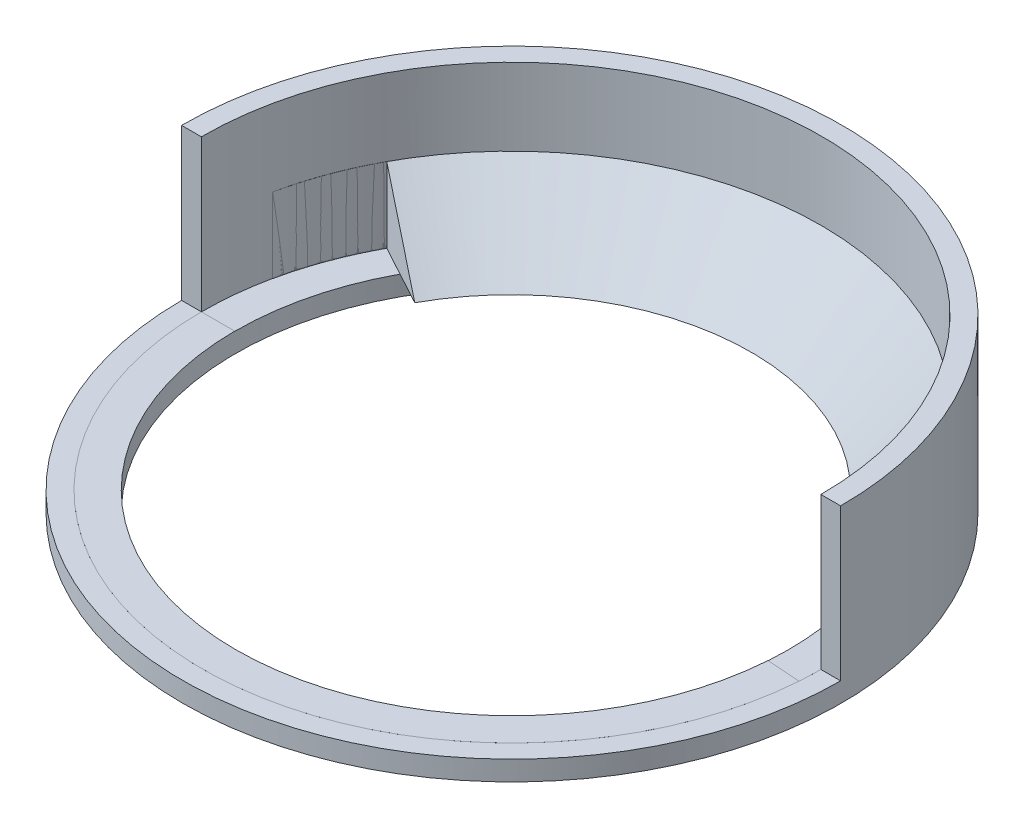
ISO-10303-21;
HEADER;
FILE_DESCRIPTION(('STEP AP214'),'2;1');
FILE_NAME('part.step','',(''),(''),'','','');
FILE_SCHEMA(('AUTOMOTIVE_DESIGN { 1 0 10303 214 1 1 1 1 }'));
ENDSEC;
DATA;
#1=APPLICATION_CONTEXT('core data for automotive mechanical design processes');
#2=APPLICATION_PROTOCOL_DEFINITION('international standard','automotive_design',2000,#1);
#3=PRODUCT_CONTEXT('',#1,'mechanical');
#4=PRODUCT('Part','Part','',(#3));
#5=PRODUCT_RELATED_PRODUCT_CATEGORY('part','',(#4));
#6=PRODUCT_DEFINITION_FORMATION('','',#4);
#7=PRODUCT_DEFINITION_CONTEXT('part definition',#1,'design');
#8=PRODUCT_DEFINITION('design','',#6,#7);
#9=PRODUCT_DEFINITION_SHAPE('','',#8);
#10=(LENGTH_UNIT() NAMED_UNIT(*) SI_UNIT(.MILLI.,.METRE.));
#11=(NAMED_UNIT(*) PLANE_ANGLE_UNIT() SI_UNIT($,.RADIAN.));
#12=(NAMED_UNIT(*) SI_UNIT($,.STERADIAN.) SOLID_ANGLE_UNIT());
#13=UNCERTAINTY_MEASURE_WITH_UNIT(LENGTH_MEASURE(1.E-05),#10,'distance_accuracy_value','');
#14=(GEOMETRIC_REPRESENTATION_CONTEXT(3) GLOBAL_UNCERTAINTY_ASSIGNED_CONTEXT((#13)) GLOBAL_UNIT_ASSIGNED_CONTEXT((#10,
#11,#12)) REPRESENTATION_CONTEXT('',''));
#15=CARTESIAN_POINT('',(0.,0.,0.));
#16=DIRECTION('',(0.,0.,1.));
#17=DIRECTION('',(1.,0.,0.));
#18=AXIS2_PLACEMENT_3D('',#15,#16,#17);
#19=CARTESIAN_POINT('',(-23.4999038261825,1.5,0.0712084203185763));
#20=DIRECTION('',(0.,1.,0.));
#21=DIRECTION('',(-1.,0.,0.));
#22=AXIS2_PLACEMENT_3D('',#19,#20,#21);
#23=PLANE('',#22);
#24=DIRECTION('',(-0.894413130287023,0.,0.447241715820616));
#25=VECTOR('',#24,1.);
#26=CARTESIAN_POINT('',(-18.8278166940009,1.5,9.41464828527145));
#27=LINE('',#26,#25);
#28=CARTESIAN_POINT('',(20.9917102742925,1.5,-10.4966801170182));
#29=VERTEX_POINT('',#28);
#30=CARTESIAN_POINT('',(16.2570612315681,1.5,-8.12916952267244));
#31=VERTEX_POINT('',#30);
#32=EDGE_CURVE('E118',#29,#31,#27,.T.);
#33=ORIENTED_EDGE('',*,*,#32,.T.);
#34=CARTESIAN_POINT('',(0.,1.5,0.0671069133202412));
#35=DIRECTION('',(0.,-1.,0.));
#36=DIRECTION('',(1.,0.,0.));
#37=AXIS2_PLACEMENT_3D('',#34,#35,#36);
#38=CIRCLE('',#37,18.2063446990922);
#39=CARTESIAN_POINT('',(-15.9988902095269,1.5,-8.62234067359039));
#40=VERTEX_POINT('',#39);
#41=EDGE_CURVE('E117',#40,#31,#38,.T.);
#42=ORIENTED_EDGE('',*,*,#41,.F.);
#43=DIRECTION('',(0.878753559484383,0.,0.477275792067362));
#44=VECTOR('',#43,1.);
#45=CARTESIAN_POINT('',(-18.1450892599968,1.5,-9.78800178607371));
#46=LINE('',#45,#44);
#47=CARTESIAN_POINT('',(-20.6506141570449,1.50000000000001,-11.148822879629));
#48=VERTEX_POINT('',#47);
#49=EDGE_CURVE('E98',#48,#40,#46,.T.);
#50=ORIENTED_EDGE('',*,*,#49,.F.);
#51=CARTESIAN_POINT('',(0.,1.5,0.0671069133202412));
#52=DIRECTION('',(0.,1.,0.));
#53=DIRECTION('',(-1.,0.,0.));
#54=AXIS2_PLACEMENT_3D('',#51,#52,#53);
#55=CIRCLE('',#54,23.4998924717436);
#56=CARTESIAN_POINT('',(-22.9848333838979,1.50000000000001,-4.8259882725473));
#57=VERTEX_POINT('',#56);
#58=EDGE_CURVE('E104',#57,#48,#55,.F.);
#59=ORIENTED_EDGE('',*,*,#58,.F.);
#60=DIRECTION('',(0.978082491719274,0.,0.208217769155797));
#61=VECTOR('',#60,1.);
#62=CARTESIAN_POINT('',(-22.4802386811067,1.5,-4.71856831131445));
#63=LINE('',#62,#61);
#64=CARTESIAN_POINT('',(-22.9848448395551,1.5,-4.82599071126938));
#65=VERTEX_POINT('',#64);
#66=EDGE_CURVE('E124',#65,#57,#63,.T.);
#67=ORIENTED_EDGE('',*,*,#66,.F.);
#68=CARTESIAN_POINT('',(0.,1.5,0.0671069133202412));
#69=DIRECTION('',(0.,-1.,0.));
#70=DIRECTION('',(1.,0.,0.));
#71=AXIS2_PLACEMENT_3D('',#68,#69,#70);
#72=CIRCLE('',#71,23.4999041841065);
#73=EDGE_CURVE('E113',#65,#29,#72,.T.);
#74=ORIENTED_EDGE('',*,*,#73,.T.);
#75=EDGE_LOOP('',(#33,#42,#50,#59,#67,#74));
#76=FACE_BOUND('',#75,.T.);
#77=ADVANCED_FACE('F46',(#76),#23,.F.);
#78=CARTESIAN_POINT('',(0.,7.18907418889528,0.0671069133202412));
#79=DIRECTION('',(0.,1.,0.));
#80=DIRECTION('',(-1.,0.,0.));
#81=AXIS2_PLACEMENT_3D('',#78,#79,#80);
#82=CONICAL_SURFACE('',#81,23.4999041841065,0.749400982278209);
#83=CARTESIAN_POINT('',(0.,7.189061601429,0.0671069133202412));
#84=DIRECTION('',(0.,1.,0.));
#85=DIRECTION('',(-1.,0.,0.));
#86=AXIS2_PLACEMENT_3D('',#83,#84,#85);
#87=CIRCLE('',#86,23.4998924717436);
#88=CARTESIAN_POINT('',(-22.984833383898,7.18906160142902,-4.82598827254731));
#89=VERTEX_POINT('',#88);
#90=CARTESIAN_POINT('',(-20.6506141570449,7.18906160142901,-11.148822879629));
#91=VERTEX_POINT('',#90);
#92=EDGE_CURVE('E62',#89,#91,#87,.F.);
#93=ORIENTED_EDGE('',*,*,#92,.T.);
#94=DIRECTION('',(0.598607226270921,-0.732097051273404,0.325120433336666));
#95=VECTOR('',#94,1.);
#96=CARTESIAN_POINT('',(0.,-18.0666537789848,0.0671069133202412));
#97=LINE('',#96,#95);
#98=EDGE_CURVE('E12',#91,#40,#97,.T.);
#99=ORIENTED_EDGE('',*,*,#98,.T.);
#100=ORIENTED_EDGE('',*,*,#41,.T.);
#101=CARTESIAN_POINT('',(20.9918767212185,7.18927418889528,-10.4967633470227));
#102=CARTESIAN_POINT('',(20.2027135171331,6.24102802044445,-10.1021507306533));
#103=CARTESIAN_POINT('',(19.4135500870123,5.29278208714443,-9.70753800125739));
#104=CARTESIAN_POINT('',(17.8352227746996,3.396290690846,-8.91831231641224));
#105=CARTESIAN_POINT('',(17.0460588925078,2.44804522784759,-8.52369936096304));
#106=CARTESIAN_POINT('',(16.2568947842805,1.4998,-8.12908629248722));
#107=B_SPLINE_CURVE_WITH_KNOTS('',3,(#101,#102,#103,#104,#105,#106),.UNSPECIFIED.,.F.,.F.,(4,2,
4),(0.,3.88574526712097,7.771490534242),.UNSPECIFIED.);
#108=CARTESIAN_POINT('',(20.9917102742925,7.18907418889528,-10.4966801170182));
#109=VERTEX_POINT('',#108);
#110=EDGE_CURVE('E115',#109,#31,#107,.T.);
#111=ORIENTED_EDGE('',*,*,#110,.F.);
#112=CARTESIAN_POINT('',(0.,7.18907418889528,0.0671069133202412));
#113=DIRECTION('',(0.,-1.,0.));
#114=DIRECTION('',(1.,0.,0.));
#115=AXIS2_PLACEMENT_3D('',#112,#113,#114);
#116=CIRCLE('',#115,23.4999041841065);
#117=CARTESIAN_POINT('',(-22.984844839555,7.18907418889527,-4.82599071126938));
#118=VERTEX_POINT('',#117);
#119=EDGE_CURVE('E122',#118,#109,#116,.T.);
#120=ORIENTED_EDGE('',*,*,#119,.F.);
#121=DIRECTION('',(0.666270128994717,-0.732097051273404,0.141838015800248));
#122=VECTOR('',#121,1.);
#123=CARTESIAN_POINT('',(0.,-18.0666537789848,0.0671069133202412));
#124=LINE('',#123,#122);
#125=EDGE_CURVE('E108',#118,#89,#124,.T.);
#126=ORIENTED_EDGE('',*,*,#125,.T.);
#127=EDGE_LOOP('',(#93,#99,#100,#111,#120,#126));
#128=FACE_BOUND('',#127,.T.);
#129=ADVANCED_FACE('F48',(#128),#82,.F.);
#130=CARTESIAN_POINT('',(-0.0136666016917367,32.51,0.0641975172925174));
#131=DIRECTION('',(-0.208217769155797,0.,0.978082491719274));
#132=DIRECTION('',(0.978082491719274,0.,0.208217769155797));
#133=AXIS2_PLACEMENT_3D('',#130,#131,#132);
#134=PLANE('',#133);
#135=ORIENTED_EDGE('',*,*,#66,.T.);
#136=DIRECTION('',(0.,-1.,0.));
#137=VECTOR('',#136,1.);
#138=CARTESIAN_POINT('',(-22.9848333838979,27.51,-4.8259882725473));
#139=LINE('',#138,#137);
#140=EDGE_CURVE('E55',#57,#89,#139,.F.);
#141=ORIENTED_EDGE('',*,*,#140,.T.);
#142=ORIENTED_EDGE('',*,*,#125,.F.);
#143=DIRECTION('',(0.,-1.,0.));
#144=VECTOR('',#143,1.);
#145=CARTESIAN_POINT('',(-22.9848448395551,0.,-4.82599071126938));
#146=LINE('',#145,#144);
#147=EDGE_CURVE('E119',#65,#118,#146,.F.);
#148=ORIENTED_EDGE('',*,*,#147,.F.);
#149=EDGE_LOOP('',(#135,#141,#142,#148));
#150=FACE_BOUND('',#149,.T.);
#151=ADVANCED_FACE('F139',(#150),#134,.T.);
#152=CARTESIAN_POINT('',(0.,0.,0.0671069133202412));
#153=DIRECTION('',(0.,-1.,0.));
#154=DIRECTION('',(1.,0.,0.));
#155=AXIS2_PLACEMENT_3D('',#152,#153,#154);
#156=CYLINDRICAL_SURFACE('',#155,23.4999041841065);
#157=DIRECTION('',(0.,-1.,0.));
#158=VECTOR('',#157,1.);
#159=CARTESIAN_POINT('',(20.9917102742925,0.,-10.4966801170182));
#160=LINE('',#159,#158);
#161=EDGE_CURVE('E70',#29,#109,#160,.F.);
#162=ORIENTED_EDGE('',*,*,#161,.F.);
#163=ORIENTED_EDGE('',*,*,#73,.F.);
#164=ORIENTED_EDGE('',*,*,#147,.T.);
#165=ORIENTED_EDGE('',*,*,#119,.T.);
#166=EDGE_LOOP('',(#162,#163,#164,#165));
#167=FACE_BOUND('',#166,.T.);
#168=ADVANCED_FACE('F138',(#167),#156,.T.);
#169=CARTESIAN_POINT('',(0.,14.51,0.));
#170=DIRECTION('',(-0.447241715820616,0.,-0.894413130287023));
#171=DIRECTION('',(-0.894413130287023,0.,0.447241715820616));
#172=AXIS2_PLACEMENT_3D('',#169,#170,#171);
#173=PLANE('',#172);
#174=ORIENTED_EDGE('',*,*,#110,.T.);
#175=ORIENTED_EDGE('',*,*,#32,.F.);
#176=ORIENTED_EDGE('',*,*,#161,.T.);
#177=EDGE_LOOP('',(#174,#175,#176));
#178=FACE_BOUND('',#177,.T.);
#179=ADVANCED_FACE('F133',(#178),#173,.F.);
#180=CARTESIAN_POINT('',(-0.0281451629565942,27.51,0.051820483128305));
#181=DIRECTION('',(-0.477275792067362,0.,0.878753559484383));
#182=DIRECTION('',(0.878753559484383,0.,0.477275792067362));
#183=AXIS2_PLACEMENT_3D('',#180,#181,#182);
#184=PLANE('',#183);
#185=ORIENTED_EDGE('',*,*,#49,.T.);
#186=ORIENTED_EDGE('',*,*,#98,.F.);
#187=DIRECTION('',(0.,-1.,0.));
#188=VECTOR('',#187,1.);
#189=CARTESIAN_POINT('',(-20.6506141570449,27.51,-11.148822879629));
#190=LINE('',#189,#188);
#191=EDGE_CURVE('E96',#91,#48,#190,.T.);
#192=ORIENTED_EDGE('',*,*,#191,.T.);
#193=EDGE_LOOP('',(#185,#186,#192));
#194=FACE_BOUND('',#193,.T.);
#195=ADVANCED_FACE('F95',(#194),#184,.T.);
#196=CARTESIAN_POINT('',(0.,27.51,0.0671069133202412));
#197=DIRECTION('',(0.,-1.,0.));
#198=DIRECTION('',(0.,0.,-1.));
#199=AXIS2_PLACEMENT_3D('',#196,#197,#198);
#200=CYLINDRICAL_SURFACE('',#199,23.4998924717436);
#201=ORIENTED_EDGE('',*,*,#58,.T.);
#202=ORIENTED_EDGE('',*,*,#191,.F.);
#203=ORIENTED_EDGE('',*,*,#92,.F.);
#204=ORIENTED_EDGE('',*,*,#140,.F.);
#205=EDGE_LOOP('',(#201,#202,#203,#204));
#206=FACE_BOUND('',#205,.T.);
#207=ADVANCED_FACE('F102',(#206),#200,.F.);
#208=CLOSED_SHELL('',(#77,#129,#151,#168,#179,#195,#207));
#209=MANIFOLD_SOLID_BREP('B2',#208);
#210=CARTESIAN_POINT('',(0.,0.,0.0671069133202412));
#211=DIRECTION('',(-0.000174532924319865,0.,0.999999984769129));
#212=DIRECTION('',(0.999999984769129,0.,0.000174532924319865));
#213=AXIS2_PLACEMENT_3D('',#210,#211,#212);
#214=PLANE('',#213);
#215=DIRECTION('',(-0.681200332781412,-0.732097051273404,-0.000118891887938832));
#216=VECTOR('',#215,1.);
#217=CARTESIAN_POINT('',(23.4999038261825,7.18907418889528,0.0712084203187299));
#218=LINE('',#217,#216);
#219=CARTESIAN_POINT('',(23.4999038261825,7.18907418889528,0.0712084203187299));
#220=VERTEX_POINT('',#219);
#221=CARTESIAN_POINT('',(23.4998921138197,7.189061601429,0.071208418274537));
#222=VERTEX_POINT('',#221);
#223=EDGE_CURVE('E213',#220,#222,#218,.T.);
#224=ORIENTED_EDGE('',*,*,#223,.T.);
#225=DIRECTION('',(0.,-1.,0.));
#226=VECTOR('',#225,1.);
#227=CARTESIAN_POINT('',(23.4998921138197,14.51,0.071208418274537));
#228=LINE('',#227,#226);
#229=CARTESIAN_POINT('',(23.4998921138197,1.5,0.071208418274537));
#230=VERTEX_POINT('',#229);
#231=EDGE_CURVE('E44',#222,#230,#228,.T.);
#232=ORIENTED_EDGE('',*,*,#231,.T.);
#233=DIRECTION('',(-0.999999984769129,0.,-0.000174532924319865));
#234=VECTOR('',#233,1.);
#235=CARTESIAN_POINT('',(23.4999038261825,1.5,0.0712084203187299));
#236=LINE('',#235,#234);
#237=CARTESIAN_POINT('',(23.4999038261825,1.5,0.0712084203187299));
#238=VERTEX_POINT('',#237);
#239=EDGE_CURVE('E254',#238,#230,#236,.T.);
#240=ORIENTED_EDGE('',*,*,#239,.F.);
#241=DIRECTION('',(0.,1.,0.));
#242=VECTOR('',#241,1.);
#243=CARTESIAN_POINT('',(23.4999038261825,1.5,0.0712084203187299));
#244=LINE('',#243,#242);
#245=EDGE_CURVE('E252',#238,#220,#244,.T.);
#246=ORIENTED_EDGE('',*,*,#245,.T.);
#247=EDGE_LOOP('',(#224,#232,#240,#246));
#248=FACE_BOUND('',#247,.T.);
#249=ADVANCED_FACE('F205',(#248),#214,.T.);
#250=CARTESIAN_POINT('',(0.,0.,0.0671069133202412));
#251=DIRECTION('',(0.,-1.,0.));
#252=DIRECTION('',(1.,0.,0.));
#253=AXIS2_PLACEMENT_3D('',#250,#251,#252);
#254=CYLINDRICAL_SURFACE('',#253,23.4999041841065);
#255=CARTESIAN_POINT('',(0.,1.5,0.0671069133202412));
#256=DIRECTION('',(0.,-1.,0.));
#257=DIRECTION('',(1.,0.,0.));
#258=AXIS2_PLACEMENT_3D('',#255,#256,#257);
#259=CIRCLE('',#258,23.4999041841065);
#260=CARTESIAN_POINT('',(23.4999041841065,1.5,0.067106913319806));
#261=VERTEX_POINT('',#260);
#262=EDGE_CURVE('E227',#261,#238,#259,.T.);
#263=ORIENTED_EDGE('',*,*,#262,.F.);
#264=DIRECTION('',(0.,-1.,0.));
#265=VECTOR('',#264,1.);
#266=CARTESIAN_POINT('',(23.4999041841065,8.,0.0671069133198076));
#267=LINE('',#266,#265);
#268=CARTESIAN_POINT('',(23.4999041841065,7.18907418889528,0.0671069133198074));
#269=VERTEX_POINT('',#268);
#270=EDGE_CURVE('E249',#261,#269,#267,.F.);
#271=ORIENTED_EDGE('',*,*,#270,.T.);
#272=CARTESIAN_POINT('',(0.,7.18907418889528,0.0671069133202412));
#273=DIRECTION('',(0.,-1.,0.));
#274=DIRECTION('',(1.,0.,0.));
#275=AXIS2_PLACEMENT_3D('',#272,#273,#274);
#276=CIRCLE('',#275,23.4999041841065);
#277=EDGE_CURVE('E248',#269,#220,#276,.T.);
#278=ORIENTED_EDGE('',*,*,#277,.T.);
#279=ORIENTED_EDGE('',*,*,#245,.F.);
#280=EDGE_LOOP('',(#263,#271,#278,#279));
#281=FACE_BOUND('',#280,.T.);
#282=ADVANCED_FACE('F207',(#281),#254,.T.);
#283=CARTESIAN_POINT('',(-23.4999038261825,1.5,0.0712084203185763));
#284=DIRECTION('',(0.,1.,0.));
#285=DIRECTION('',(-1.,0.,0.));
#286=AXIS2_PLACEMENT_3D('',#283,#284,#285);
#287=PLANE('',#286);
#288=CARTESIAN_POINT('',(0.,1.5,0.));
#289=DIRECTION('',(0.,1.,0.));
#290=DIRECTION('',(-1.,0.,0.));
#291=AXIS2_PLACEMENT_3D('',#288,#289,#290);
#292=CIRCLE('',#291,23.5);
#293=EDGE_CURVE('E220',#261,#230,#292,.F.);
#294=ORIENTED_EDGE('',*,*,#293,.F.);
#295=ORIENTED_EDGE('',*,*,#262,.T.);
#296=ORIENTED_EDGE('',*,*,#239,.T.);
#297=EDGE_LOOP('',(#294,#295,#296));
#298=FACE_BOUND('',#297,.T.);
#299=ADVANCED_FACE('F259',(#298),#287,.F.);
#300=CARTESIAN_POINT('',(0.,7.18907418889528,0.0671069133202412));
#301=DIRECTION('',(0.,1.,0.));
#302=DIRECTION('',(-1.,0.,0.));
#303=AXIS2_PLACEMENT_3D('',#300,#301,#302);
#304=CONICAL_SURFACE('',#303,23.4999041841065,0.749400982278209);
#305=ORIENTED_EDGE('',*,*,#277,.F.);
#306=CARTESIAN_POINT('',(22.4578007167464,7.21051081967871,-6.92077936123565));
#307=CARTESIAN_POINT('',(22.5458684397292,7.20963451140363,-6.6350002844082));
#308=CARTESIAN_POINT('',(22.6284721816462,7.20875309138728,-6.34756907619321));
#309=CARTESIAN_POINT('',(22.7826525587824,7.20698113255031,-5.76976354321328));
#310=CARTESIAN_POINT('',(22.8542291686002,7.20609059370869,-5.47938921167042));
#311=CARTESIAN_POINT('',(23.0522382704685,7.2034073786324,-4.60453106232709));
#312=CARTESIAN_POINT('',(23.1619911372631,7.20160269473904,-4.01617867211953));
#313=CARTESIAN_POINT('',(23.3343524241693,7.19801311405225,-2.84605182217286));
#314=CARTESIAN_POINT('',(23.397955208201,7.19622867004704,-2.26442215155591));
#315=CARTESIAN_POINT('',(23.4816125224792,7.1926498090637,-1.09803667897976));
#316=CARTESIAN_POINT('',(23.5016681851301,7.19085539234612,-0.513280958707141));
#317=CARTESIAN_POINT('',(23.4981148287309,7.18726658290404,0.65609779937265));
#318=CARTESIAN_POINT('',(23.4745058096787,7.18547219017955,1.24072083717981));
#319=CARTESIAN_POINT('',(23.3837615841124,7.18189343143143,2.40657636135726));
#320=CARTESIAN_POINT('',(23.3166252457115,7.18010906566976,2.98780875916054));
#321=CARTESIAN_POINT('',(23.1371559480599,7.17651971689018,4.15686651273091));
#322=CARTESIAN_POINT('',(23.0238295231747,7.17471518833577,4.74454103902215));
#323=CARTESIAN_POINT('',(22.8205073158856,7.17203228794502,5.6181796758091));
#324=CARTESIAN_POINT('',(22.7471673403647,7.17114186762998,5.90811365399163));
#325=CARTESIAN_POINT('',(22.5894783216427,7.16937017857012,6.48497151951041));
#326=CARTESIAN_POINT('',(22.5051293038012,7.16848890980423,6.77189541377882));
#327=CARTESIAN_POINT('',(22.4153264462346,7.16761277188866,7.05713400104729));
#328=B_SPLINE_CURVE_WITH_KNOTS('',3,(#306,#307,#308,#309,#310,#311,#312,#313,#314,#315,#316,
#317,#318,#319,#320,#321,#322,#323,#324,#325,#326,#327),.UNSPECIFIED.,.F.,.F.,(4,2,2,2,2,2,2,2,
2,2,4),(0.,0.897012331028296,1.7940267283192,3.58763780583959,5.34135230458416,7.09502119898442,
8.8486900934688,10.6024045922921,12.3960156698908,13.2930300672353,14.1900423983208),.UNSPECIFIED.);
#329=EDGE_CURVE('E239',#269,#222,#328,.T.);
#330=ORIENTED_EDGE('',*,*,#329,.T.);
#331=ORIENTED_EDGE('',*,*,#223,.F.);
#332=EDGE_LOOP('',(#305,#330,#331));
#333=FACE_BOUND('',#332,.T.);
#334=ADVANCED_FACE('F247',(#333),#304,.F.);
#335=CARTESIAN_POINT('',(0.,14.51,0.));
#336=DIRECTION('',(0.,-1.,0.));
#337=DIRECTION('',(0.,0.,-1.));
#338=AXIS2_PLACEMENT_3D('',#335,#336,#337);
#339=CYLINDRICAL_SURFACE('',#338,23.5);
#340=ORIENTED_EDGE('',*,*,#293,.T.);
#341=ORIENTED_EDGE('',*,*,#231,.F.);
#342=ORIENTED_EDGE('',*,*,#329,.F.);
#343=ORIENTED_EDGE('',*,*,#270,.F.);
#344=EDGE_LOOP('',(#340,#341,#342,#343));
#345=FACE_BOUND('',#344,.T.);
#346=ADVANCED_FACE('F238',(#345),#339,.F.);
#347=CLOSED_SHELL('',(#249,#282,#299,#334,#346));
#348=MANIFOLD_SOLID_BREP('B6',#347);
#349=CARTESIAN_POINT('',(0.,0.,0.0671069133202412));
#350=DIRECTION('',(-0.000174532924313326,0.,-0.999999984769129));
#351=DIRECTION('',(-0.999999984769129,0.,0.000174532924313326));
#352=AXIS2_PLACEMENT_3D('',#349,#350,#351);
#353=PLANE('',#352);
#354=DIRECTION('',(0.,-1.,0.));
#355=VECTOR('',#354,1.);
#356=CARTESIAN_POINT('',(-23.4998921138197,32.51,0.0712084182743833));
#357=LINE('',#356,#355);
#358=CARTESIAN_POINT('',(-23.4998921138197,7.189061601429,0.0712084182743833));
#359=VERTEX_POINT('',#358);
#360=CARTESIAN_POINT('',(-23.4998921138197,1.5,0.0712084182743833));
#361=VERTEX_POINT('',#360);
#362=EDGE_CURVE('E203',#359,#361,#357,.T.);
#363=ORIENTED_EDGE('',*,*,#362,.F.);
#364=DIRECTION('',(0.681200332781412,-0.732097051273404,-0.000118891887934378));
#365=VECTOR('',#364,1.);
#366=CARTESIAN_POINT('',(-23.4999038261825,7.18907418889528,0.0712084203185763));
#367=LINE('',#366,#365);
#368=CARTESIAN_POINT('',(-23.4999038261825,7.18907418889528,0.0712084203185763));
#369=VERTEX_POINT('',#368);
#370=EDGE_CURVE('E368',#369,#359,#367,.T.);
#371=ORIENTED_EDGE('',*,*,#370,.F.);
#372=DIRECTION('',(0.,1.,0.));
#373=VECTOR('',#372,1.);
#374=CARTESIAN_POINT('',(-23.4999038261825,1.5,0.0712084203185763));
#375=LINE('',#374,#373);
#376=CARTESIAN_POINT('',(-23.4999038261825,1.5,0.0712084203185763));
#377=VERTEX_POINT('',#376);
#378=EDGE_CURVE('E367',#377,#369,#375,.T.);
#379=ORIENTED_EDGE('',*,*,#378,.F.);
#380=DIRECTION('',(0.999999984769129,0.,-0.000174532924313326));
#381=VECTOR('',#380,1.);
#382=CARTESIAN_POINT('',(-23.4999038261825,1.5,0.0712084203185763));
#383=LINE('',#382,#381);
#384=EDGE_CURVE('E364',#377,#361,#383,.T.);
#385=ORIENTED_EDGE('',*,*,#384,.T.);
#386=EDGE_LOOP('',(#363,#371,#379,#385));
#387=FACE_BOUND('',#386,.T.);
#388=ADVANCED_FACE('F320',(#387),#353,.F.);
#389=CARTESIAN_POINT('',(-23.4999038261825,1.5,0.0712084203185763));
#390=DIRECTION('',(0.,1.,0.));
#391=DIRECTION('',(-1.,0.,0.));
#392=AXIS2_PLACEMENT_3D('',#389,#390,#391);
#393=PLANE('',#392);
#394=CARTESIAN_POINT('',(0.,1.5,0.));
#395=DIRECTION('',(0.,1.,0.));
#396=DIRECTION('',(-1.,0.,0.));
#397=AXIS2_PLACEMENT_3D('',#394,#395,#396);
#398=CIRCLE('',#397,23.5);
#399=CARTESIAN_POINT('',(-23.4999041841065,1.5,0.0671069133198052));
#400=VERTEX_POINT('',#399);
#401=EDGE_CURVE('E356',#361,#400,#398,.F.);
#402=ORIENTED_EDGE('',*,*,#401,.F.);
#403=ORIENTED_EDGE('',*,*,#384,.F.);
#404=CARTESIAN_POINT('',(0.,1.5,0.0671069133202412));
#405=DIRECTION('',(0.,-1.,0.));
#406=DIRECTION('',(1.,0.,0.));
#407=AXIS2_PLACEMENT_3D('',#404,#405,#406);
#408=CIRCLE('',#407,23.4999041841065);
#409=EDGE_CURVE('E343',#377,#400,#408,.T.);
#410=ORIENTED_EDGE('',*,*,#409,.T.);
#411=EDGE_LOOP('',(#402,#403,#410));
#412=FACE_BOUND('',#411,.T.);
#413=ADVANCED_FACE('F363',(#412),#393,.F.);
#414=CARTESIAN_POINT('',(0.,7.18907418889528,0.0671069133202412));
#415=DIRECTION('',(0.,1.,0.));
#416=DIRECTION('',(-1.,0.,0.));
#417=AXIS2_PLACEMENT_3D('',#414,#415,#416);
#418=CONICAL_SURFACE('',#417,23.4999041841065,0.749400982278209);
#419=ORIENTED_EDGE('',*,*,#370,.T.);
#420=CARTESIAN_POINT('',(-23.2461740235106,7.17870652508064,3.44461801491274));
#421=CARTESIAN_POINT('',(-23.2875660048715,7.17956419733754,3.16526841094402));
#422=CARTESIAN_POINT('',(-23.323918958471,7.18042397873071,2.88521758946755));
#423=CARTESIAN_POINT('',(-23.3865149604174,7.18214705155668,2.32394387147732));
#424=CARTESIAN_POINT('',(-23.4127564202022,7.18301034351951,2.04272079780673));
#425=CARTESIAN_POINT('',(-23.4761626505671,7.18560050491537,1.19891509738462));
#426=CARTESIAN_POINT('',(-23.4981776784892,7.18733115164444,0.6350586945628));
#427=CARTESIAN_POINT('',(-23.499961916812,7.18913205515056,0.0482517565382171));
#428=CARTESIAN_POINT('',(-23.4999980614177,7.18920312130131,0.0250954427116041));
#429=CARTESIAN_POINT('',(-23.5000562608557,7.19142847339734,-0.700020091315089));
#430=CARTESIAN_POINT('',(-23.4686076026368,7.19358408405179,-1.40250101882371));
#431=CARTESIAN_POINT('',(-23.3743792372781,7.1968040790267,-2.45198212345832));
#432=CARTESIAN_POINT('',(-23.3350806325278,7.19787596279887,-2.8013596492706));
#433=CARTESIAN_POINT('',(-23.2408503275213,7.20001328343821,-3.4980574029053));
#434=CARTESIAN_POINT('',(-23.1859172545101,7.20107871973089,-3.84537744733966));
#435=CARTESIAN_POINT('',(-23.0093488941437,7.20406663870247,-4.81946608479084));
#436=CARTESIAN_POINT('',(-22.8698551757286,7.20597931084976,-5.44308650186013));
#437=CARTESIAN_POINT('',(-22.5405141669642,7.20976359368856,-6.67707671354056));
#438=CARTESIAN_POINT('',(-22.3506457529532,7.21163518679707,-7.28744083294721));
#439=CARTESIAN_POINT('',(-21.9213462714817,7.21532839069119,-8.49199905438257));
#440=CARTESIAN_POINT('',(-21.6818143405226,7.21714989107915,-9.08615742062686));
#441=CARTESIAN_POINT('',(-21.2868688481378,7.21983162228396,-9.96100719998872));
#442=CARTESIAN_POINT('',(-21.1492898157139,7.22071705338961,-10.249873116098));
#443=CARTESIAN_POINT('',(-20.8624562165418,7.22246987119584,-10.8217474984037));
#444=CARTESIAN_POINT('',(-20.7132016976083,7.2233372579703,-11.1047559885821));
#445=CARTESIAN_POINT('',(-20.5582137579307,7.22419500101389,-11.3846320574373));
#446=B_SPLINE_CURVE_WITH_KNOTS('',3,(#420,#421,#422,#423,#424,#425,#426,#427,#428,#429,#430,
#431,#432,#433,#434,#435,#436,#437,#438,#439,#440,#441,#442,#443,#444,#445),.UNSPECIFIED.,.F.,
.F.,(4,2,2,2,2,2,2,2,2,2,2,2,4),(0.,0.847066761153676,1.69426654618492,3.38522429525503,
3.45469456476897,5.56055908918154,6.61505462114684,7.66964276967082,9.58445567316823,
11.5000727892441,13.4196191971643,14.3792598739766,15.3388966209823),.UNSPECIFIED.);
#447=CARTESIAN_POINT('',(-23.4999041841065,7.18907418889528,0.0671069133198058));
#448=VERTEX_POINT('',#447);
#449=EDGE_CURVE('E335',#359,#448,#446,.T.);
#450=ORIENTED_EDGE('',*,*,#449,.T.);
#451=CARTESIAN_POINT('',(0.,7.18907418889528,0.0671069133202412));
#452=DIRECTION('',(0.,-1.,0.));
#453=DIRECTION('',(1.,0.,0.));
#454=AXIS2_PLACEMENT_3D('',#451,#452,#453);
#455=CIRCLE('',#454,23.4999041841065);
#456=EDGE_CURVE('E329',#369,#448,#455,.T.);
#457=ORIENTED_EDGE('',*,*,#456,.F.);
#458=EDGE_LOOP('',(#419,#450,#457));
#459=FACE_BOUND('',#458,.T.);
#460=ADVANCED_FACE('F322',(#459),#418,.F.);
#461=CARTESIAN_POINT('',(0.,0.,0.0671069133202412));
#462=DIRECTION('',(0.,-1.,0.));
#463=DIRECTION('',(1.,0.,0.));
#464=AXIS2_PLACEMENT_3D('',#461,#462,#463);
#465=CYLINDRICAL_SURFACE('',#464,23.4999041841065);
#466=ORIENTED_EDGE('',*,*,#456,.T.);
#467=DIRECTION('',(0.,-1.,0.));
#468=VECTOR('',#467,1.);
#469=CARTESIAN_POINT('',(-23.4999041841065,17.,0.0671069133198014));
#470=LINE('',#469,#468);
#471=EDGE_CURVE('E365',#448,#400,#470,.T.);
#472=ORIENTED_EDGE('',*,*,#471,.T.);
#473=ORIENTED_EDGE('',*,*,#409,.F.);
#474=ORIENTED_EDGE('',*,*,#378,.T.);
#475=EDGE_LOOP('',(#466,#472,#473,#474));
#476=FACE_BOUND('',#475,.T.);
#477=ADVANCED_FACE('F374',(#476),#465,.T.);
#478=CARTESIAN_POINT('',(0.,32.51,0.));
#479=DIRECTION('',(0.,-1.,0.));
#480=DIRECTION('',(0.,0.,-1.));
#481=AXIS2_PLACEMENT_3D('',#478,#479,#480);
#482=CYLINDRICAL_SURFACE('',#481,23.5);
#483=ORIENTED_EDGE('',*,*,#362,.T.);
#484=ORIENTED_EDGE('',*,*,#401,.T.);
#485=ORIENTED_EDGE('',*,*,#471,.F.);
#486=ORIENTED_EDGE('',*,*,#449,.F.);
#487=EDGE_LOOP('',(#483,#484,#485,#486));
#488=FACE_BOUND('',#487,.T.);
#489=ADVANCED_FACE('F355',(#488),#482,.F.);
#490=CLOSED_SHELL('',(#388,#413,#460,#477,#489));
#491=MANIFOLD_SOLID_BREP('B38',#490);
#492=CARTESIAN_POINT('',(0.,1.5,0.));
#493=DIRECTION('',(0.,1.,0.));
#494=DIRECTION('',(0.,0.,1.));
#495=AXIS2_PLACEMENT_3D('',#492,#493,#494);
#496=PLANE('',#495);
#497=CARTESIAN_POINT('',(0.,1.5,0.));
#498=DIRECTION('',(0.,1.,0.));
#499=DIRECTION('',(0.,0.,1.));
#500=AXIS2_PLACEMENT_3D('',#497,#498,#499);
#501=CIRCLE('',#500,20.9643438486524);
#502=CARTESIAN_POINT('',(18.7507844060867,1.5,-9.3761291139247));
#503=VERTEX_POINT('',#502);
#504=CARTESIAN_POINT('',(-18.4505640593543,1.5,-9.95391374767706));
#505=VERTEX_POINT('',#504);
#506=EDGE_CURVE('E443',#503,#505,#501,.T.);
#507=ORIENTED_EDGE('',*,*,#506,.F.);
#508=DIRECTION('',(-0.894413130287023,0.,0.447241715820616));
#509=VECTOR('',#508,1.);
#510=CARTESIAN_POINT('',(0.,1.5,0.));
#511=LINE('',#510,#509);
#512=CARTESIAN_POINT('',(21.018708561745,1.5,-10.5101803217845));
#513=VERTEX_POINT('',#512);
#514=EDGE_CURVE('E559',#513,#503,#511,.T.);
#515=ORIENTED_EDGE('',*,*,#514,.F.);
#516=CARTESIAN_POINT('',(0.,1.5,0.));
#517=DIRECTION('',(0.,1.,0.));
#518=DIRECTION('',(0.,0.,1.));
#519=AXIS2_PLACEMENT_3D('',#516,#517,#518);
#520=CIRCLE('',#519,23.5);
#521=CARTESIAN_POINT('',(-22.9985155042715,1.5,-4.82890097224863));
#522=VERTEX_POINT('',#521);
#523=EDGE_CURVE('E618',#522,#513,#520,.F.);
#524=ORIENTED_EDGE('',*,*,#523,.F.);
#525=DIRECTION('',(0.978082491719274,0.,0.208217769155797));
#526=VECTOR('',#525,1.);
#527=CARTESIAN_POINT('',(-0.0136666016917367,1.5,0.0641975172925174));
#528=LINE('',#527,#526);
#529=CARTESIAN_POINT('',(-22.9848333838979,1.50000000000001,-4.8259882725473));
#530=VERTEX_POINT('',#529);
#531=EDGE_CURVE('E437',#522,#530,#528,.T.);
#532=ORIENTED_EDGE('',*,*,#531,.T.);
#533=CARTESIAN_POINT('',(0.,1.5,0.0671069133202412));
#534=DIRECTION('',(0.,1.,0.));
#535=DIRECTION('',(0.,0.,1.));
#536=AXIS2_PLACEMENT_3D('',#533,#534,#535);
#537=CIRCLE('',#536,23.4998924717436);
#538=CARTESIAN_POINT('',(-20.6506141570449,1.50000000000001,-11.148822879629));
#539=VERTEX_POINT('',#538);
#540=EDGE_CURVE('E625',#530,#539,#537,.F.);
#541=ORIENTED_EDGE('',*,*,#540,.T.);
#542=DIRECTION('',(0.878753559484383,0.,0.477275792067362));
#543=VECTOR('',#542,1.);
#544=CARTESIAN_POINT('',(-0.0281451629565942,1.5,0.051820483128305));
#545=LINE('',#544,#543);
#546=EDGE_CURVE('E664',#539,#505,#545,.T.);
#547=ORIENTED_EDGE('',*,*,#546,.T.);
#548=EDGE_LOOP('',(#507,#515,#524,#532,#541,#547));
#549=FACE_BOUND('',#548,.T.);
#550=ADVANCED_FACE('F429',(#549),#496,.T.);
#551=CARTESIAN_POINT('',(-20.9642244120187,1.5,0.0707658607685606));
#552=VERTEX_POINT('',#551);
#553=CARTESIAN_POINT('',(20.9116039328337,1.5,1.48611371059778));
#554=VERTEX_POINT('',#553);
#555=EDGE_CURVE('E533',#552,#554,#501,.T.);
#556=ORIENTED_EDGE('',*,*,#555,.F.);
#557=DIRECTION('',(0.999999984769129,0.,-0.000174532924313326));
#558=VECTOR('',#557,1.);
#559=CARTESIAN_POINT('',(1.17123656450331E-05,1.5,0.0671069112760477));
#560=LINE('',#559,#558);
#561=CARTESIAN_POINT('',(-23.4998921138197,1.5,0.0712084182743833));
#562=VERTEX_POINT('',#561);
#563=EDGE_CURVE('E582',#562,#552,#560,.T.);
#564=ORIENTED_EDGE('',*,*,#563,.F.);
#565=CARTESIAN_POINT('',(23.4408811441613,1.5,1.66586049394972));
#566=VERTEX_POINT('',#565);
#567=EDGE_CURVE('E558',#566,#562,#520,.F.);
#568=ORIENTED_EDGE('',*,*,#567,.F.);
#569=DIRECTION('',(-0.997484304006865,0.,-0.0708876805936049));
#570=VECTOR('',#569,1.);
#571=CARTESIAN_POINT('',(0.,1.5,0.));
#572=LINE('',#571,#570);
#573=EDGE_CURVE('E549',#566,#554,#572,.T.);
#574=ORIENTED_EDGE('',*,*,#573,.T.);
#575=EDGE_LOOP('',(#556,#564,#568,#574));
#576=FACE_BOUND('',#575,.T.);
#577=ADVANCED_FACE('F557',(#576),#496,.T.);
#578=CARTESIAN_POINT('',(-0.0136666016917367,32.51,0.0641975172925174));
#579=DIRECTION('',(-0.208217769155797,0.,0.978082491719274));
#580=DIRECTION('',(0.978082491719274,0.,0.208217769155797));
#581=AXIS2_PLACEMENT_3D('',#578,#579,#580);
#582=PLANE('',#581);
#583=DIRECTION('',(-0.978082491719274,0.,-0.208217769155797));
#584=VECTOR('',#583,1.);
#585=CARTESIAN_POINT('',(-0.0136666016917367,1.49,0.0641975172925174));
#586=LINE('',#585,#584);
#587=CARTESIAN_POINT('',(-22.984833383898,1.49,-4.82598827254731));
#588=VERTEX_POINT('',#587);
#589=CARTESIAN_POINT('',(-22.9985155042715,1.49,-4.82890097224863));
#590=VERTEX_POINT('',#589);
#591=EDGE_CURVE('E570',#588,#590,#586,.T.);
#592=ORIENTED_EDGE('',*,*,#591,.F.);
#593=DIRECTION('',(0.,-1.,0.));
#594=VECTOR('',#593,1.);
#595=CARTESIAN_POINT('',(-22.9848333838979,27.51,-4.8259882725473));
#596=LINE('',#595,#594);
#597=EDGE_CURVE('E633',#530,#588,#596,.T.);
#598=ORIENTED_EDGE('',*,*,#597,.F.);
#599=ORIENTED_EDGE('',*,*,#531,.F.);
#600=DIRECTION('',(0.,-1.,0.));
#601=VECTOR('',#600,1.);
#602=CARTESIAN_POINT('',(-22.9985155042715,32.51,-4.82890097224863));
#603=LINE('',#602,#601);
#604=EDGE_CURVE('E579',#522,#590,#603,.T.);
#605=ORIENTED_EDGE('',*,*,#604,.T.);
#606=EDGE_LOOP('',(#592,#598,#599,#605));
#607=FACE_BOUND('',#606,.T.);
#608=ADVANCED_FACE('F631',(#607),#582,.T.);
#609=CARTESIAN_POINT('',(0.,16.5,0.));
#610=DIRECTION('',(0.,-1.,0.));
#611=DIRECTION('',(0.,0.,-1.));
#612=AXIS2_PLACEMENT_3D('',#609,#610,#611);
#613=CYLINDRICAL_SURFACE('',#612,23.5);
#614=DIRECTION('',(0.,-1.,0.));
#615=VECTOR('',#614,1.);
#616=CARTESIAN_POINT('',(23.4408811441613,14.51,1.66586049394972));
#617=LINE('',#616,#615);
#618=CARTESIAN_POINT('',(23.4408811441613,1.499,1.66586049394972));
#619=VERTEX_POINT('',#618);
#620=EDGE_CURVE('E560',#566,#619,#617,.T.);
#621=ORIENTED_EDGE('',*,*,#620,.F.);
#622=ORIENTED_EDGE('',*,*,#567,.T.);
#623=DIRECTION('',(0.,-1.,0.));
#624=VECTOR('',#623,1.);
#625=CARTESIAN_POINT('',(-23.4998921138197,32.51,0.0712084182743833));
#626=LINE('',#625,#624);
#627=CARTESIAN_POINT('',(-23.4998921138197,1.499,0.0712084182743833));
#628=VERTEX_POINT('',#627);
#629=EDGE_CURVE('E578',#562,#628,#626,.T.);
#630=ORIENTED_EDGE('',*,*,#629,.T.);
#631=CARTESIAN_POINT('',(0.,1.499,0.));
#632=DIRECTION('',(0.,1.,0.));
#633=DIRECTION('',(0.,0.,1.));
#634=AXIS2_PLACEMENT_3D('',#631,#632,#633);
#635=CIRCLE('',#634,23.5);
#636=EDGE_CURVE('E588',#628,#619,#635,.T.);
#637=ORIENTED_EDGE('',*,*,#636,.T.);
#638=EDGE_LOOP('',(#621,#622,#630,#637));
#639=FACE_BOUND('',#638,.T.);
#640=ADVANCED_FACE('F720',(#639),#613,.T.);
#641=CARTESIAN_POINT('',(0.,1.5,0.));
#642=DIRECTION('',(0.,-1.,0.));
#643=DIRECTION('',(0.,0.,-1.));
#644=AXIS2_PLACEMENT_3D('',#641,#642,#643);
#645=CYLINDRICAL_SURFACE('',#644,25.);
#646=CARTESIAN_POINT('',(0.,0.,0.));
#647=DIRECTION('',(0.,1.,0.));
#648=DIRECTION('',(0.,0.,1.));
#649=AXIS2_PLACEMENT_3D('',#646,#647,#648);
#650=CIRCLE('',#649,25.);
#651=CARTESIAN_POINT('',(0.,0.,25.));
#652=VERTEX_POINT('',#651);
#653=EDGE_CURVE('E615',#652,#652,#650,.T.);
#654=ORIENTED_EDGE('',*,*,#653,.T.);
#655=EDGE_LOOP('',(#654));
#656=FACE_BOUND('',#655,.T.);
#657=DIRECTION('',(0.,-1.,0.));
#658=VECTOR('',#657,1.);
#659=CARTESIAN_POINT('',(-24.9999099330815,16.5,0.0671069133202441));
#660=LINE('',#659,#658);
#661=CARTESIAN_POINT('',(-24.9999099330815,13.,0.0671069133202441));
#662=VERTEX_POINT('',#661);
#663=CARTESIAN_POINT('',(-24.9999099330815,1.499,0.0671069133202441));
#664=VERTEX_POINT('',#663);
#665=EDGE_CURVE('E601',#662,#664,#660,.T.);
#666=ORIENTED_EDGE('',*,*,#665,.F.);
#667=CARTESIAN_POINT('',(0.,13.,0.));
#668=DIRECTION('',(0.,1.,0.));
#669=DIRECTION('',(0.,0.,1.));
#670=AXIS2_PLACEMENT_3D('',#667,#668,#669);
#671=CIRCLE('',#670,25.);
#672=CARTESIAN_POINT('',(24.9999099330815,13.,0.0671069133202441));
#673=VERTEX_POINT('',#672);
#674=EDGE_CURVE('E610',#673,#662,#671,.T.);
#675=ORIENTED_EDGE('',*,*,#674,.F.);
#676=DIRECTION('',(0.,-1.,0.));
#677=VECTOR('',#676,1.);
#678=CARTESIAN_POINT('',(24.9999099330815,16.5,0.0671069133202441));
#679=LINE('',#678,#677);
#680=CARTESIAN_POINT('',(24.9999099330815,1.499,0.0671069133202441));
#681=VERTEX_POINT('',#680);
#682=EDGE_CURVE('E598',#673,#681,#679,.T.);
#683=ORIENTED_EDGE('',*,*,#682,.T.);
#684=CARTESIAN_POINT('',(0.,1.499,0.));
#685=DIRECTION('',(0.,1.,0.));
#686=DIRECTION('',(0.,0.,1.));
#687=AXIS2_PLACEMENT_3D('',#684,#685,#686);
#688=CIRCLE('',#687,25.);
#689=EDGE_CURVE('E591',#664,#681,#688,.T.);
#690=ORIENTED_EDGE('',*,*,#689,.F.);
#691=EDGE_LOOP('',(#666,#675,#683,#690));
#692=FACE_BOUND('',#691,.T.);
#693=ADVANCED_FACE('F431',(#656,#692),#645,.T.);
#694=CARTESIAN_POINT('',(0.,13.,0.));
#695=DIRECTION('',(0.,-1.,0.));
#696=DIRECTION('',(0.,0.,-1.));
#697=AXIS2_PLACEMENT_3D('',#694,#695,#696);
#698=CYLINDRICAL_SURFACE('',#697,23.5);
#699=ORIENTED_EDGE('',*,*,#523,.T.);
#700=DIRECTION('',(0.,-1.,0.));
#701=VECTOR('',#700,1.);
#702=CARTESIAN_POINT('',(21.018708561745,14.51,-10.5101803217845));
#703=LINE('',#702,#701);
#704=CARTESIAN_POINT('',(21.018708561745,1.49,-10.5101803217845));
#705=VERTEX_POINT('',#704);
#706=EDGE_CURVE('E671',#513,#705,#703,.T.);
#707=ORIENTED_EDGE('',*,*,#706,.T.);
#708=CARTESIAN_POINT('',(0.,1.49,0.));
#709=DIRECTION('',(0.,1.,0.));
#710=DIRECTION('',(0.,0.,1.));
#711=AXIS2_PLACEMENT_3D('',#708,#709,#710);
#712=CIRCLE('',#711,23.5);
#713=CARTESIAN_POINT('',(23.4408811441613,1.49,1.66586049394972));
#714=VERTEX_POINT('',#713);
#715=EDGE_CURVE('E669',#714,#705,#712,.T.);
#716=ORIENTED_EDGE('',*,*,#715,.F.);
#717=EDGE_CURVE('E565',#619,#714,#617,.T.);
#718=ORIENTED_EDGE('',*,*,#717,.F.);
#719=CARTESIAN_POINT('',(23.4999041841065,1.499,0.067106913320244));
#720=VERTEX_POINT('',#719);
#721=EDGE_CURVE('E584',#619,#720,#635,.T.);
#722=ORIENTED_EDGE('',*,*,#721,.T.);
#723=DIRECTION('',(0.,-1.,0.));
#724=VECTOR('',#723,1.);
#725=CARTESIAN_POINT('',(23.4999041841065,16.5,0.067106913320244));
#726=LINE('',#725,#724);
#727=CARTESIAN_POINT('',(23.4999041841065,13.,0.067106913320244));
#728=VERTEX_POINT('',#727);
#729=EDGE_CURVE('E596',#728,#720,#726,.T.);
#730=ORIENTED_EDGE('',*,*,#729,.F.);
#731=CARTESIAN_POINT('',(0.,13.,0.));
#732=DIRECTION('',(0.,1.,0.));
#733=DIRECTION('',(0.,0.,1.));
#734=AXIS2_PLACEMENT_3D('',#731,#732,#733);
#735=CIRCLE('',#734,23.5);
#736=CARTESIAN_POINT('',(-23.4999041841065,13.,0.067106913320244));
#737=VERTEX_POINT('',#736);
#738=EDGE_CURVE('E613',#728,#737,#735,.T.);
#739=ORIENTED_EDGE('',*,*,#738,.T.);
#740=DIRECTION('',(0.,-1.,0.));
#741=VECTOR('',#740,1.);
#742=CARTESIAN_POINT('',(-23.4999041841065,16.5,0.067106913320244));
#743=LINE('',#742,#741);
#744=CARTESIAN_POINT('',(-23.4999041841065,1.499,0.067106913320244));
#745=VERTEX_POINT('',#744);
#746=EDGE_CURVE('E603',#737,#745,#743,.T.);
#747=ORIENTED_EDGE('',*,*,#746,.T.);
#748=EDGE_CURVE('E585',#745,#628,#635,.T.);
#749=ORIENTED_EDGE('',*,*,#748,.T.);
#750=CARTESIAN_POINT('',(-23.4998921138197,1.49,0.0712084182743833));
#751=VERTEX_POINT('',#750);
#752=EDGE_CURVE('E575',#628,#751,#626,.T.);
#753=ORIENTED_EDGE('',*,*,#752,.T.);
#754=CARTESIAN_POINT('',(0.,1.49,0.));
#755=DIRECTION('',(0.,1.,0.));
#756=DIRECTION('',(0.,0.,1.));
#757=AXIS2_PLACEMENT_3D('',#754,#755,#756);
#758=CIRCLE('',#757,23.5);
#759=EDGE_CURVE('E572',#590,#751,#758,.T.);
#760=ORIENTED_EDGE('',*,*,#759,.F.);
#761=ORIENTED_EDGE('',*,*,#604,.F.);
#762=EDGE_LOOP('',(#699,#707,#716,#718,#722,#730,#739,#747,#749,#753,#760,#761));
#763=FACE_BOUND('',#762,.T.);
#764=ADVANCED_FACE('F635',(#763),#698,.F.);
#765=CARTESIAN_POINT('',(0.,13.,0.));
#766=DIRECTION('',(0.,1.,0.));
#767=DIRECTION('',(0.,0.,1.));
#768=AXIS2_PLACEMENT_3D('',#765,#766,#767);
#769=PLANE('',#768);
#770=ORIENTED_EDGE('',*,*,#674,.T.);
#771=DIRECTION('',(1.,0.,0.));
#772=VECTOR('',#771,1.);
#773=CARTESIAN_POINT('',(0.,13.,0.0671069133202412));
#774=LINE('',#773,#772);
#775=EDGE_CURVE('E607',#662,#737,#774,.T.);
#776=ORIENTED_EDGE('',*,*,#775,.T.);
#777=ORIENTED_EDGE('',*,*,#738,.F.);
#778=DIRECTION('',(-1.,0.,0.));
#779=VECTOR('',#778,1.);
#780=CARTESIAN_POINT('',(0.,13.,0.0671069133202412));
#781=LINE('',#780,#779);
#782=EDGE_CURVE('E605',#673,#728,#781,.T.);
#783=ORIENTED_EDGE('',*,*,#782,.F.);
#784=EDGE_LOOP('',(#770,#776,#777,#783));
#785=FACE_BOUND('',#784,.T.);
#786=ADVANCED_FACE('F704',(#785),#769,.T.);
#787=CARTESIAN_POINT('',(0.,0.,0.));
#788=DIRECTION('',(0.,1.,0.));
#789=DIRECTION('',(0.,0.,1.));
#790=AXIS2_PLACEMENT_3D('',#787,#788,#789);
#791=PLANE('',#790);
#792=CARTESIAN_POINT('',(0.,0.,0.));
#793=DIRECTION('',(0.,1.,0.));
#794=DIRECTION('',(0.,0.,1.));
#795=AXIS2_PLACEMENT_3D('',#792,#793,#794);
#796=CIRCLE('',#795,20.9643438486524);
#797=CARTESIAN_POINT('',(0.,0.,20.9643438486524));
#798=VERTEX_POINT('',#797);
#799=EDGE_CURVE('E653',#798,#798,#796,.T.);
#800=ORIENTED_EDGE('',*,*,#799,.T.);
#801=EDGE_LOOP('',(#800));
#802=FACE_BOUND('',#801,.T.);
#803=ORIENTED_EDGE('',*,*,#653,.F.);
#804=EDGE_LOOP('',(#803));
#805=FACE_BOUND('',#804,.T.);
#806=ADVANCED_FACE('F701',(#802,#805),#791,.F.);
#807=CARTESIAN_POINT('',(0.,16.5,0.0671069133202412));
#808=DIRECTION('',(0.,0.,1.));
#809=DIRECTION('',(1.,0.,0.));
#810=AXIS2_PLACEMENT_3D('',#807,#808,#809);
#811=PLANE('',#810);
#812=ORIENTED_EDGE('',*,*,#665,.T.);
#813=DIRECTION('',(-1.,0.,0.));
#814=VECTOR('',#813,1.);
#815=CARTESIAN_POINT('',(0.,1.499,0.0671069133202412));
#816=LINE('',#815,#814);
#817=EDGE_CURVE('E587',#745,#664,#816,.T.);
#818=ORIENTED_EDGE('',*,*,#817,.F.);
#819=ORIENTED_EDGE('',*,*,#746,.F.);
#820=ORIENTED_EDGE('',*,*,#775,.F.);
#821=EDGE_LOOP('',(#812,#818,#819,#820));
#822=FACE_BOUND('',#821,.T.);
#823=ADVANCED_FACE('F703',(#822),#811,.T.);
#824=CARTESIAN_POINT('',(0.,16.5,0.0671069133202412));
#825=DIRECTION('',(0.,0.,-1.));
#826=DIRECTION('',(-1.,0.,0.));
#827=AXIS2_PLACEMENT_3D('',#824,#825,#826);
#828=PLANE('',#827);
#829=ORIENTED_EDGE('',*,*,#782,.T.);
#830=ORIENTED_EDGE('',*,*,#729,.T.);
#831=DIRECTION('',(1.,0.,0.));
#832=VECTOR('',#831,1.);
#833=CARTESIAN_POINT('',(0.,1.499,0.0671069133202412));
#834=LINE('',#833,#832);
#835=EDGE_CURVE('E594',#720,#681,#834,.T.);
#836=ORIENTED_EDGE('',*,*,#835,.T.);
#837=ORIENTED_EDGE('',*,*,#682,.F.);
#838=EDGE_LOOP('',(#829,#830,#836,#837));
#839=FACE_BOUND('',#838,.T.);
#840=ADVANCED_FACE('F710',(#839),#828,.F.);
#841=CARTESIAN_POINT('',(0.,1.499,0.));
#842=DIRECTION('',(0.,1.,0.));
#843=DIRECTION('',(0.,0.,1.));
#844=AXIS2_PLACEMENT_3D('',#841,#842,#843);
#845=PLANE('',#844);
#846=ORIENTED_EDGE('',*,*,#748,.F.);
#847=ORIENTED_EDGE('',*,*,#817,.T.);
#848=ORIENTED_EDGE('',*,*,#689,.T.);
#849=ORIENTED_EDGE('',*,*,#835,.F.);
#850=ORIENTED_EDGE('',*,*,#721,.F.);
#851=ORIENTED_EDGE('',*,*,#636,.F.);
#852=EDGE_LOOP('',(#846,#847,#848,#849,#850,#851));
#853=FACE_BOUND('',#852,.T.);
#854=ADVANCED_FACE('F735',(#853),#845,.T.);
#855=CARTESIAN_POINT('',(1.17123656450331E-05,32.51,0.0671069112760477));
#856=DIRECTION('',(0.000174532924313326,0.,0.999999984769129));
#857=DIRECTION('',(0.999999984769129,0.,-0.000174532924313326));
#858=AXIS2_PLACEMENT_3D('',#855,#856,#857);
#859=PLANE('',#858);
#860=ORIENTED_EDGE('',*,*,#563,.T.);
#861=DIRECTION('',(0.,1.,0.));
#862=VECTOR('',#861,1.);
#863=CARTESIAN_POINT('',(-20.9642244120187,-8.5,0.0707658607685606));
#864=LINE('',#863,#862);
#865=CARTESIAN_POINT('',(-20.9642244120187,1.49,0.0707658607685606));
#866=VERTEX_POINT('',#865);
#867=EDGE_CURVE('E540',#552,#866,#864,.F.);
#868=ORIENTED_EDGE('',*,*,#867,.T.);
#869=DIRECTION('',(-0.999999984769129,0.,0.000174532924313326));
#870=VECTOR('',#869,1.);
#871=CARTESIAN_POINT('',(1.17123656450331E-05,1.49,0.0671069112760477));
#872=LINE('',#871,#870);
#873=EDGE_CURVE('E563',#866,#751,#872,.T.);
#874=ORIENTED_EDGE('',*,*,#873,.T.);
#875=ORIENTED_EDGE('',*,*,#752,.F.);
#876=ORIENTED_EDGE('',*,*,#629,.F.);
#877=EDGE_LOOP('',(#860,#868,#874,#875,#876));
#878=FACE_BOUND('',#877,.T.);
#879=ADVANCED_FACE('F644',(#878),#859,.F.);
#880=CARTESIAN_POINT('',(0.,1.49,0.));
#881=DIRECTION('',(0.,1.,0.));
#882=DIRECTION('',(0.,0.,1.));
#883=AXIS2_PLACEMENT_3D('',#880,#881,#882);
#884=PLANE('',#883);
#885=CARTESIAN_POINT('',(0.,1.49,0.));
#886=DIRECTION('',(0.,1.,0.));
#887=DIRECTION('',(0.,0.,1.));
#888=AXIS2_PLACEMENT_3D('',#885,#886,#887);
#889=CIRCLE('',#888,20.9643438486524);
#890=CARTESIAN_POINT('',(-18.4505640593543,1.49,-9.95391374767706));
#891=VERTEX_POINT('',#890);
#892=EDGE_CURVE('E641',#891,#866,#889,.T.);
#893=ORIENTED_EDGE('',*,*,#892,.F.);
#894=DIRECTION('',(-0.878753559484383,0.,-0.477275792067362));
#895=VECTOR('',#894,1.);
#896=CARTESIAN_POINT('',(-0.0281451629565942,1.49,0.051820483128305));
#897=LINE('',#896,#895);
#898=CARTESIAN_POINT('',(-20.6506141570449,1.49,-11.148822879629));
#899=VERTEX_POINT('',#898);
#900=EDGE_CURVE('E656',#891,#899,#897,.T.);
#901=ORIENTED_EDGE('',*,*,#900,.T.);
#902=CARTESIAN_POINT('',(0.,1.49,0.0671069133202412));
#903=DIRECTION('',(0.,1.,0.));
#904=DIRECTION('',(0.,0.,1.));
#905=AXIS2_PLACEMENT_3D('',#902,#903,#904);
#906=CIRCLE('',#905,23.4998924717436);
#907=EDGE_CURVE('E451',#899,#588,#906,.T.);
#908=ORIENTED_EDGE('',*,*,#907,.T.);
#909=ORIENTED_EDGE('',*,*,#591,.T.);
#910=ORIENTED_EDGE('',*,*,#759,.T.);
#911=ORIENTED_EDGE('',*,*,#873,.F.);
#912=EDGE_LOOP('',(#893,#901,#908,#909,#910,#911));
#913=FACE_BOUND('',#912,.T.);
#914=ADVANCED_FACE('F640',(#913),#884,.T.);
#915=CARTESIAN_POINT('',(0.,14.51,0.));
#916=DIRECTION('',(-0.447241715820616,0.,-0.894413130287023));
#917=DIRECTION('',(-0.894413130287023,0.,0.447241715820616));
#918=AXIS2_PLACEMENT_3D('',#915,#916,#917);
#919=PLANE('',#918);
#920=ORIENTED_EDGE('',*,*,#514,.T.);
#921=DIRECTION('',(0.,1.,0.));
#922=VECTOR('',#921,1.);
#923=CARTESIAN_POINT('',(18.7507844060867,-8.5,-9.3761291139247));
#924=LINE('',#923,#922);
#925=CARTESIAN_POINT('',(18.7507844060867,1.49,-9.3761291139247));
#926=VERTEX_POINT('',#925);
#927=EDGE_CURVE('E553',#503,#926,#924,.F.);
#928=ORIENTED_EDGE('',*,*,#927,.T.);
#929=DIRECTION('',(0.894413130287023,0.,-0.447241715820616));
#930=VECTOR('',#929,1.);
#931=CARTESIAN_POINT('',(0.,1.49,0.));
#932=LINE('',#931,#930);
#933=EDGE_CURVE('E666',#926,#705,#932,.T.);
#934=ORIENTED_EDGE('',*,*,#933,.T.);
#935=ORIENTED_EDGE('',*,*,#706,.F.);
#936=EDGE_LOOP('',(#920,#928,#934,#935));
#937=FACE_BOUND('',#936,.T.);
#938=ADVANCED_FACE('F680',(#937),#919,.F.);
#939=CARTESIAN_POINT('',(0.,14.51,0.));
#940=DIRECTION('',(0.0708876805936049,0.,-0.997484304006865));
#941=DIRECTION('',(-0.997484304006865,0.,-0.0708876805936049));
#942=AXIS2_PLACEMENT_3D('',#939,#940,#941);
#943=PLANE('',#942);
#944=DIRECTION('',(0.,1.,0.));
#945=VECTOR('',#944,1.);
#946=CARTESIAN_POINT('',(20.9116039328337,-8.5,1.48611371059778));
#947=LINE('',#946,#945);
#948=CARTESIAN_POINT('',(20.9116039328337,1.49,1.48611371059778));
#949=VERTEX_POINT('',#948);
#950=EDGE_CURVE('E537',#554,#949,#947,.F.);
#951=ORIENTED_EDGE('',*,*,#950,.F.);
#952=ORIENTED_EDGE('',*,*,#573,.F.);
#953=ORIENTED_EDGE('',*,*,#620,.T.);
#954=ORIENTED_EDGE('',*,*,#717,.T.);
#955=DIRECTION('',(0.997484304006865,0.,0.0708876805936049));
#956=VECTOR('',#955,1.);
#957=CARTESIAN_POINT('',(0.,1.49,0.));
#958=LINE('',#957,#956);
#959=EDGE_CURVE('E552',#949,#714,#958,.T.);
#960=ORIENTED_EDGE('',*,*,#959,.F.);
#961=EDGE_LOOP('',(#951,#952,#953,#954,#960));
#962=FACE_BOUND('',#961,.T.);
#963=ADVANCED_FACE('F548',(#962),#943,.T.);
#964=CARTESIAN_POINT('',(0.,1.49,0.));
#965=DIRECTION('',(0.,1.,0.));
#966=DIRECTION('',(0.,0.,1.));
#967=AXIS2_PLACEMENT_3D('',#964,#965,#966);
#968=PLANE('',#967);
#969=CARTESIAN_POINT('',(0.,1.49,0.));
#970=DIRECTION('',(0.,1.,0.));
#971=DIRECTION('',(0.,0.,1.));
#972=AXIS2_PLACEMENT_3D('',#969,#970,#971);
#973=CIRCLE('',#972,20.9643438486524);
#974=EDGE_CURVE('E554',#949,#926,#973,.T.);
#975=ORIENTED_EDGE('',*,*,#974,.F.);
#976=ORIENTED_EDGE('',*,*,#959,.T.);
#977=ORIENTED_EDGE('',*,*,#715,.T.);
#978=ORIENTED_EDGE('',*,*,#933,.F.);
#979=EDGE_LOOP('',(#975,#976,#977,#978));
#980=FACE_BOUND('',#979,.T.);
#981=ADVANCED_FACE('F678',(#980),#968,.T.);
#982=CARTESIAN_POINT('',(-0.0281451629565942,27.51,0.051820483128305));
#983=DIRECTION('',(-0.477275792067362,0.,0.878753559484383));
#984=DIRECTION('',(0.878753559484383,0.,0.477275792067362));
#985=AXIS2_PLACEMENT_3D('',#982,#983,#984);
#986=PLANE('',#985);
#987=DIRECTION('',(0.,1.,0.));
#988=VECTOR('',#987,1.);
#989=CARTESIAN_POINT('',(-18.4505640593543,-8.5,-9.95391374767706));
#990=LINE('',#989,#988);
#991=EDGE_CURVE('E318',#505,#891,#990,.F.);
#992=ORIENTED_EDGE('',*,*,#991,.F.);
#993=ORIENTED_EDGE('',*,*,#546,.F.);
#994=DIRECTION('',(0.,-1.,0.));
#995=VECTOR('',#994,1.);
#996=CARTESIAN_POINT('',(-20.6506141570449,27.51,-11.148822879629));
#997=LINE('',#996,#995);
#998=EDGE_CURVE('E660',#539,#899,#997,.T.);
#999=ORIENTED_EDGE('',*,*,#998,.T.);
#1000=ORIENTED_EDGE('',*,*,#900,.F.);
#1001=EDGE_LOOP('',(#992,#993,#999,#1000));
#1002=FACE_BOUND('',#1001,.T.);
#1003=ADVANCED_FACE('F683',(#1002),#986,.T.);
#1004=CARTESIAN_POINT('',(0.,27.51,0.0671069133202412));
#1005=DIRECTION('',(0.,-1.,0.));
#1006=DIRECTION('',(0.,0.,-1.));
#1007=AXIS2_PLACEMENT_3D('',#1004,#1005,#1006);
#1008=CYLINDRICAL_SURFACE('',#1007,23.4998924717436);
#1009=ORIENTED_EDGE('',*,*,#597,.T.);
#1010=ORIENTED_EDGE('',*,*,#907,.F.);
#1011=ORIENTED_EDGE('',*,*,#998,.F.);
#1012=ORIENTED_EDGE('',*,*,#540,.F.);
#1013=EDGE_LOOP('',(#1009,#1010,#1011,#1012));
#1014=FACE_BOUND('',#1013,.T.);
#1015=ADVANCED_FACE('F685',(#1014),#1008,.F.);
#1016=CARTESIAN_POINT('',(0.,-8.5,0.));
#1017=DIRECTION('',(0.,1.,0.));
#1018=DIRECTION('',(0.,0.,1.));
#1019=AXIS2_PLACEMENT_3D('',#1016,#1017,#1018);
#1020=CYLINDRICAL_SURFACE('',#1019,20.9643438486524);
#1021=ORIENTED_EDGE('',*,*,#506,.T.);
#1022=ORIENTED_EDGE('',*,*,#991,.T.);
#1023=ORIENTED_EDGE('',*,*,#892,.T.);
#1024=ORIENTED_EDGE('',*,*,#867,.F.);
#1025=ORIENTED_EDGE('',*,*,#555,.T.);
#1026=ORIENTED_EDGE('',*,*,#950,.T.);
#1027=ORIENTED_EDGE('',*,*,#974,.T.);
#1028=ORIENTED_EDGE('',*,*,#927,.F.);
#1029=EDGE_LOOP('',(#1021,#1022,#1023,#1024,#1025,#1026,#1027,#1028));
#1030=FACE_BOUND('',#1029,.T.);
#1031=ORIENTED_EDGE('',*,*,#799,.F.);
#1032=EDGE_LOOP('',(#1031));
#1033=FACE_BOUND('',#1032,.T.);
#1034=ADVANCED_FACE('F535',(#1030,#1033),#1020,.F.);
#1035=CLOSED_SHELL('',(#550,#577,#608,#640,#693,#764,#786,#806,#823,#840,#854,#879,#914,#938,
#963,#981,#1003,#1015,#1034));
#1036=MANIFOLD_SOLID_BREP('B197',#1035);
#1037=ADVANCED_BREP_SHAPE_REPRESENTATION('',(#18,#209,#348,#491,#1036),#14);
#1038=SHAPE_DEFINITION_REPRESENTATION(#9,#1037);
ENDSEC;
END-ISO-10303-21;
